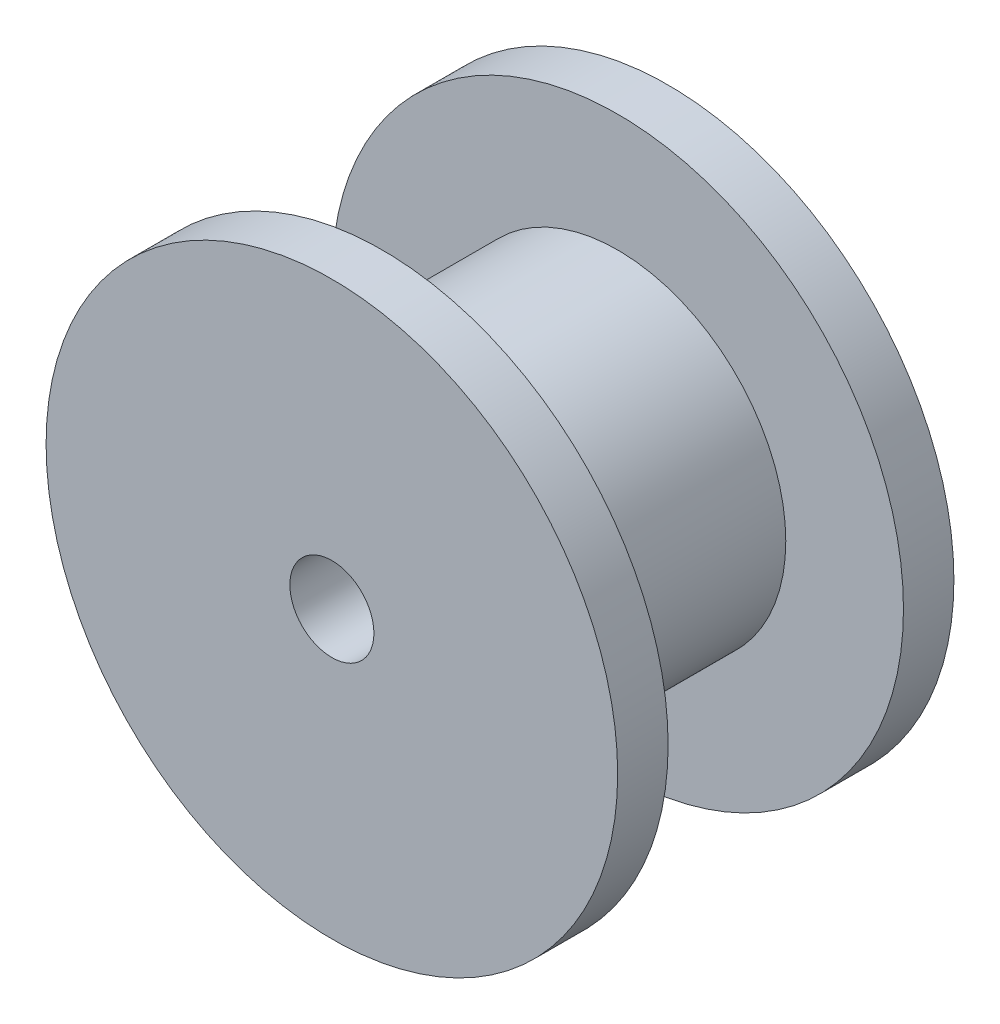
ISO-10303-21;
HEADER;
FILE_DESCRIPTION(('STEP AP214'),'2;1');
FILE_NAME('part.step','',(''),(''),'','','');
FILE_SCHEMA(('AUTOMOTIVE_DESIGN { 1 0 10303 214 1 1 1 1 }'));
ENDSEC;
DATA;
#1=APPLICATION_CONTEXT('core data for automotive mechanical design processes');
#2=APPLICATION_PROTOCOL_DEFINITION('international standard','automotive_design',2000,#1);
#3=PRODUCT_CONTEXT('',#1,'mechanical');
#4=PRODUCT('Part','Part','',(#3));
#5=PRODUCT_RELATED_PRODUCT_CATEGORY('part','',(#4));
#6=PRODUCT_DEFINITION_FORMATION('','',#4);
#7=PRODUCT_DEFINITION_CONTEXT('part definition',#1,'design');
#8=PRODUCT_DEFINITION('design','',#6,#7);
#9=PRODUCT_DEFINITION_SHAPE('','',#8);
#10=(LENGTH_UNIT() NAMED_UNIT(*) SI_UNIT(.MILLI.,.METRE.));
#11=(NAMED_UNIT(*) PLANE_ANGLE_UNIT() SI_UNIT($,.RADIAN.));
#12=(NAMED_UNIT(*) SI_UNIT($,.STERADIAN.) SOLID_ANGLE_UNIT());
#13=UNCERTAINTY_MEASURE_WITH_UNIT(LENGTH_MEASURE(1.E-05),#10,'distance_accuracy_value','');
#14=(GEOMETRIC_REPRESENTATION_CONTEXT(3) GLOBAL_UNCERTAINTY_ASSIGNED_CONTEXT((#13)) GLOBAL_UNIT_ASSIGNED_CONTEXT((#10,
#11,#12)) REPRESENTATION_CONTEXT('',''));
#15=CARTESIAN_POINT('',(0.,0.,0.));
#16=DIRECTION('',(0.,0.,1.));
#17=DIRECTION('',(1.,0.,0.));
#18=AXIS2_PLACEMENT_3D('',#15,#16,#17);
#19=CARTESIAN_POINT('',(0.,0.,-10.));
#20=DIRECTION('',(0.,0.,1.));
#21=DIRECTION('',(1.,0.,0.));
#22=AXIS2_PLACEMENT_3D('',#19,#20,#21);
#23=PLANE('',#22);
#24=CARTESIAN_POINT('',(0.,0.,-9.99999999999999));
#25=DIRECTION('',(0.,0.,1.));
#26=DIRECTION('',(1.,0.,0.));
#27=AXIS2_PLACEMENT_3D('',#24,#25,#26);
#28=CIRCLE('',#27,1.24999999999999);
#29=CARTESIAN_POINT('',(1.24999999999999,0.,-9.99999999999999));
#30=VERTEX_POINT('',#29);
#31=EDGE_CURVE('E62',#30,#30,#28,.T.);
#32=ORIENTED_EDGE('',*,*,#31,.T.);
#33=EDGE_LOOP('',(#32));
#34=FACE_BOUND('',#33,.T.);
#35=CARTESIAN_POINT('',(0.,0.,-10.));
#36=DIRECTION('',(0.,0.,1.));
#37=DIRECTION('',(1.,0.,0.));
#38=AXIS2_PLACEMENT_3D('',#35,#36,#37);
#39=CIRCLE('',#38,8.49999999999997);
#40=CARTESIAN_POINT('',(8.49999999999993,0.,-10.0000000000001));
#41=VERTEX_POINT('',#40);
#42=EDGE_CURVE('E10',#41,#41,#39,.T.);
#43=ORIENTED_EDGE('',*,*,#42,.F.);
#44=EDGE_LOOP('',(#43));
#45=FACE_BOUND('',#44,.T.);
#46=ADVANCED_FACE('F37',(#34,#45),#23,.F.);
#47=CARTESIAN_POINT('',(6.80793955430827E-13,0.,198.467795093582));
#48=DIRECTION('',(0.,0.,1.));
#49=DIRECTION('',(1.,0.,0.));
#50=AXIS2_PLACEMENT_3D('',#47,#48,#49);
#51=CYLINDRICAL_SURFACE('',#50,8.49999999999997);
#52=CARTESIAN_POINT('',(0.,0.,-8.50000000000004));
#53=DIRECTION('',(0.,0.,1.));
#54=DIRECTION('',(1.,0.,0.));
#55=AXIS2_PLACEMENT_3D('',#52,#53,#54);
#56=CIRCLE('',#55,8.49999999999997);
#57=CARTESIAN_POINT('',(8.49999999999994,0.,-8.50000000000006));
#58=VERTEX_POINT('',#57);
#59=EDGE_CURVE('E43',#58,#58,#56,.T.);
#60=ORIENTED_EDGE('',*,*,#59,.F.);
#61=EDGE_LOOP('',(#60));
#62=FACE_BOUND('',#61,.T.);
#63=ORIENTED_EDGE('',*,*,#42,.T.);
#64=EDGE_LOOP('',(#63));
#65=FACE_BOUND('',#64,.T.);
#66=ADVANCED_FACE('F97',(#62,#65),#51,.T.);
#67=CARTESIAN_POINT('',(-8.5,0.,-8.49999999999999));
#68=DIRECTION('',(0.,0.,-1.));
#69=DIRECTION('',(-1.,0.,0.));
#70=AXIS2_PLACEMENT_3D('',#67,#68,#69);
#71=PLANE('',#70);
#72=CARTESIAN_POINT('',(0.,0.,-8.50000000000004));
#73=DIRECTION('',(0.,0.,1.));
#74=DIRECTION('',(1.,0.,0.));
#75=AXIS2_PLACEMENT_3D('',#72,#73,#74);
#76=CIRCLE('',#75,4.99999999999997);
#77=CARTESIAN_POINT('',(4.99999999999994,0.,-8.50000000000005));
#78=VERTEX_POINT('',#77);
#79=EDGE_CURVE('E47',#78,#78,#76,.T.);
#80=ORIENTED_EDGE('',*,*,#79,.F.);
#81=EDGE_LOOP('',(#80));
#82=FACE_BOUND('',#81,.T.);
#83=ORIENTED_EDGE('',*,*,#59,.T.);
#84=EDGE_LOOP('',(#83));
#85=FACE_BOUND('',#84,.T.);
#86=ADVANCED_FACE('F92',(#82,#85),#71,.F.);
#87=CARTESIAN_POINT('',(6.80793955430827E-13,0.,198.467795093582));
#88=DIRECTION('',(0.,0.,1.));
#89=DIRECTION('',(1.,0.,0.));
#90=AXIS2_PLACEMENT_3D('',#87,#88,#89);
#91=CYLINDRICAL_SURFACE('',#90,4.99999999999998);
#92=CARTESIAN_POINT('',(0.,0.,-1.50000000000003));
#93=DIRECTION('',(0.,0.,1.));
#94=DIRECTION('',(1.,0.,0.));
#95=AXIS2_PLACEMENT_3D('',#92,#93,#94);
#96=CIRCLE('',#95,4.99999999999999);
#97=CARTESIAN_POINT('',(4.99999999999999,0.,-1.50000000000005));
#98=VERTEX_POINT('',#97);
#99=EDGE_CURVE('E51',#98,#98,#96,.T.);
#100=ORIENTED_EDGE('',*,*,#99,.F.);
#101=EDGE_LOOP('',(#100));
#102=FACE_BOUND('',#101,.T.);
#103=ORIENTED_EDGE('',*,*,#79,.T.);
#104=EDGE_LOOP('',(#103));
#105=FACE_BOUND('',#104,.T.);
#106=ADVANCED_FACE('F86',(#102,#105),#91,.T.);
#107=CARTESIAN_POINT('',(-5.,0.,-1.50000000000001));
#108=DIRECTION('',(0.,0.,1.));
#109=DIRECTION('',(1.,0.,0.));
#110=AXIS2_PLACEMENT_3D('',#107,#108,#109);
#111=PLANE('',#110);
#112=CARTESIAN_POINT('',(0.,0.,-1.50000000000003));
#113=DIRECTION('',(0.,0.,1.));
#114=DIRECTION('',(1.,0.,0.));
#115=AXIS2_PLACEMENT_3D('',#112,#113,#114);
#116=CIRCLE('',#115,8.49999999999999);
#117=CARTESIAN_POINT('',(8.49999999999999,0.,-1.50000000000006));
#118=VERTEX_POINT('',#117);
#119=EDGE_CURVE('E56',#118,#118,#116,.T.);
#120=ORIENTED_EDGE('',*,*,#119,.F.);
#121=EDGE_LOOP('',(#120));
#122=FACE_BOUND('',#121,.T.);
#123=ORIENTED_EDGE('',*,*,#99,.T.);
#124=EDGE_LOOP('',(#123));
#125=FACE_BOUND('',#124,.T.);
#126=ADVANCED_FACE('F80',(#122,#125),#111,.F.);
#127=CARTESIAN_POINT('',(6.80793955430827E-13,0.,198.467795093582));
#128=DIRECTION('',(0.,0.,1.));
#129=DIRECTION('',(1.,0.,0.));
#130=AXIS2_PLACEMENT_3D('',#127,#128,#129);
#131=CYLINDRICAL_SURFACE('',#130,8.5);
#132=CARTESIAN_POINT('',(0.,0.,0.));
#133=DIRECTION('',(0.,0.,1.));
#134=DIRECTION('',(1.,0.,0.));
#135=AXIS2_PLACEMENT_3D('',#132,#133,#134);
#136=CIRCLE('',#135,8.5);
#137=CARTESIAN_POINT('',(8.5,0.,0.));
#138=VERTEX_POINT('',#137);
#139=EDGE_CURVE('E59',#138,#138,#136,.T.);
#140=ORIENTED_EDGE('',*,*,#139,.F.);
#141=EDGE_LOOP('',(#140));
#142=FACE_BOUND('',#141,.T.);
#143=ORIENTED_EDGE('',*,*,#119,.T.);
#144=EDGE_LOOP('',(#143));
#145=FACE_BOUND('',#144,.T.);
#146=ADVANCED_FACE('F74',(#142,#145),#131,.T.);
#147=CARTESIAN_POINT('',(-8.5,0.,0.));
#148=DIRECTION('',(0.,0.,-1.));
#149=DIRECTION('',(-1.,0.,0.));
#150=AXIS2_PLACEMENT_3D('',#147,#148,#149);
#151=PLANE('',#150);
#152=CARTESIAN_POINT('',(0.,0.,0.));
#153=DIRECTION('',(0.,0.,1.));
#154=DIRECTION('',(1.,0.,0.));
#155=AXIS2_PLACEMENT_3D('',#152,#153,#154);
#156=CIRCLE('',#155,1.24999999999999);
#157=CARTESIAN_POINT('',(1.24999999999999,0.,0.));
#158=VERTEX_POINT('',#157);
#159=EDGE_CURVE('E65',#158,#158,#156,.T.);
#160=ORIENTED_EDGE('',*,*,#159,.F.);
#161=EDGE_LOOP('',(#160));
#162=FACE_BOUND('',#161,.T.);
#163=ORIENTED_EDGE('',*,*,#139,.T.);
#164=EDGE_LOOP('',(#163));
#165=FACE_BOUND('',#164,.T.);
#166=ADVANCED_FACE('F71',(#162,#165),#151,.F.);
#167=CARTESIAN_POINT('',(0.,0.,0.));
#168=DIRECTION('',(0.,0.,1.));
#169=DIRECTION('',(1.,0.,0.));
#170=AXIS2_PLACEMENT_3D('',#167,#168,#169);
#171=CYLINDRICAL_SURFACE('',#170,1.24999999999999);
#172=ORIENTED_EDGE('',*,*,#31,.F.);
#173=EDGE_LOOP('',(#172));
#174=FACE_BOUND('',#173,.T.);
#175=ORIENTED_EDGE('',*,*,#159,.T.);
#176=EDGE_LOOP('',(#175));
#177=FACE_BOUND('',#176,.T.);
#178=ADVANCED_FACE('F69',(#174,#177),#171,.F.);
#179=CLOSED_SHELL('',(#46,#66,#86,#106,#126,#146,#166,#178));
#180=MANIFOLD_SOLID_BREP('B2',#179);
#181=ADVANCED_BREP_SHAPE_REPRESENTATION('',(#18,#180),#14);
#182=SHAPE_DEFINITION_REPRESENTATION(#9,#181);
ENDSEC;
END-ISO-10303-21;
